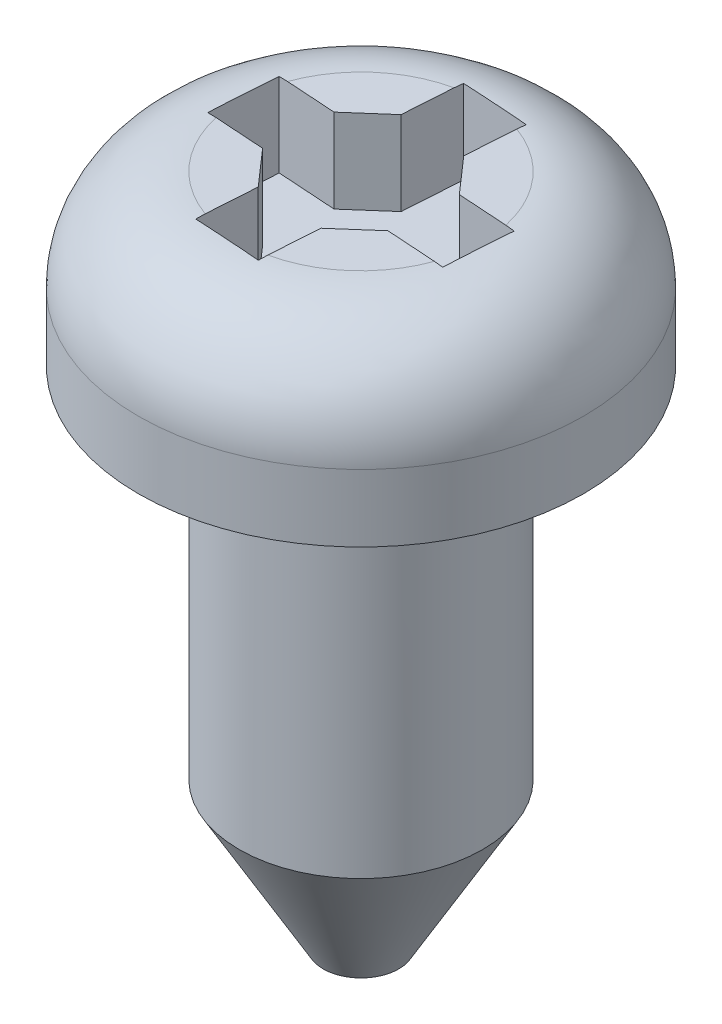
ISO-10303-21;
HEADER;
FILE_DESCRIPTION(('STEP AP214'),'2;1');
FILE_NAME('part.step','',(''),(''),'','','');
FILE_SCHEMA(('AUTOMOTIVE_DESIGN { 1 0 10303 214 1 1 1 1 }'));
ENDSEC;
DATA;
#1=APPLICATION_CONTEXT('core data for automotive mechanical design processes');
#2=APPLICATION_PROTOCOL_DEFINITION('international standard','automotive_design',2000,#1);
#3=PRODUCT_CONTEXT('',#1,'mechanical');
#4=PRODUCT('Part','Part','',(#3));
#5=PRODUCT_RELATED_PRODUCT_CATEGORY('part','',(#4));
#6=PRODUCT_DEFINITION_FORMATION('','',#4);
#7=PRODUCT_DEFINITION_CONTEXT('part definition',#1,'design');
#8=PRODUCT_DEFINITION('design','',#6,#7);
#9=PRODUCT_DEFINITION_SHAPE('','',#8);
#10=(LENGTH_UNIT() NAMED_UNIT(*) SI_UNIT(.MILLI.,.METRE.));
#11=(NAMED_UNIT(*) PLANE_ANGLE_UNIT() SI_UNIT($,.RADIAN.));
#12=(NAMED_UNIT(*) SI_UNIT($,.STERADIAN.) SOLID_ANGLE_UNIT());
#13=UNCERTAINTY_MEASURE_WITH_UNIT(LENGTH_MEASURE(1.E-05),#10,'distance_accuracy_value','');
#14=(GEOMETRIC_REPRESENTATION_CONTEXT(3) GLOBAL_UNCERTAINTY_ASSIGNED_CONTEXT((#13)) GLOBAL_UNIT_ASSIGNED_CONTEXT((#10,
#11,#12)) REPRESENTATION_CONTEXT('',''));
#15=CARTESIAN_POINT('',(0.,0.,0.));
#16=DIRECTION('',(0.,0.,1.));
#17=DIRECTION('',(1.,0.,0.));
#18=AXIS2_PLACEMENT_3D('',#15,#16,#17);
#19=CARTESIAN_POINT('',(-26.0259458430014,9.29457308248913,-134.653126441172));
#20=DIRECTION('',(-0.751797824615177,0.,0.659393684306946));
#21=DIRECTION('',(0.659393684306946,0.,0.751797824615177));
#22=AXIS2_PLACEMENT_3D('',#19,#20,#21);
#23=PLANE('',#22);
#24=DIRECTION('',(0.,1.,0.));
#25=VECTOR('',#24,1.);
#26=CARTESIAN_POINT('',(-25.6529364464854,9.29457308248913,-134.227845369279));
#27=LINE('',#26,#25);
#28=CARTESIAN_POINT('',(-25.6529364464853,10.2945730824891,-134.227845369279));
#29=VERTEX_POINT('',#28);
#30=CARTESIAN_POINT('',(-25.6529364464854,9.29457308248913,-134.227845369279));
#31=VERTEX_POINT('',#30);
#32=EDGE_CURVE('E557',#29,#31,#27,.F.);
#33=ORIENTED_EDGE('',*,*,#32,.T.);
#34=DIRECTION('',(-0.659393684307242,0.,-0.751797824614917));
#35=VECTOR('',#34,1.);
#36=CARTESIAN_POINT('',(-25.6529364464854,9.29457308248913,-134.227845369279));
#37=LINE('',#36,#35);
#38=CARTESIAN_POINT('',(-26.0259458430014,9.29457308248913,-134.653126441173));
#39=VERTEX_POINT('',#38);
#40=EDGE_CURVE('E555',#31,#39,#37,.T.);
#41=ORIENTED_EDGE('',*,*,#40,.T.);
#42=DIRECTION('',(0.,1.,0.));
#43=VECTOR('',#42,1.);
#44=CARTESIAN_POINT('',(-26.0259458430013,9.29457308248913,-134.653126441173));
#45=LINE('',#44,#43);
#46=CARTESIAN_POINT('',(-26.0259458430015,10.2945730824891,-134.653126441173));
#47=VERTEX_POINT('',#46);
#48=EDGE_CURVE('E540',#39,#47,#45,.T.);
#49=ORIENTED_EDGE('',*,*,#48,.T.);
#50=DIRECTION('',(-0.65939368430744,0.,-0.751797824614743));
#51=VECTOR('',#50,1.);
#52=CARTESIAN_POINT('',(-25.6529364464852,10.2945730824891,-134.227845369279));
#53=LINE('',#52,#51);
#54=EDGE_CURVE('E547',#29,#47,#53,.T.);
#55=ORIENTED_EDGE('',*,*,#54,.F.);
#56=EDGE_LOOP('',(#33,#41,#49,#55));
#57=FACE_BOUND('',#56,.T.);
#58=ADVANCED_FACE('F17',(#57),#23,.F.);
#59=CARTESIAN_POINT('',(-25.9736741676241,9.29457308248913,-135.451416909582));
#60=DIRECTION('',(-0.659393684306945,0.,-0.751797824615177));
#61=DIRECTION('',(-0.751797824615177,0.,0.659393684306945));
#62=AXIS2_PLACEMENT_3D('',#59,#60,#61);
#63=PLANE('',#62);
#64=DIRECTION('',(0.,1.,0.));
#65=VECTOR('',#64,1.);
#66=CARTESIAN_POINT('',(-25.9736741676238,9.29457308248913,-135.451416909582));
#67=LINE('',#66,#65);
#68=CARTESIAN_POINT('',(-25.9736741676238,10.2945730824891,-135.451416909582));
#69=VERTEX_POINT('',#68);
#70=CARTESIAN_POINT('',(-25.9736741676239,9.29457308248913,-135.451416909582));
#71=VERTEX_POINT('',#70);
#72=EDGE_CURVE('E140',#69,#71,#67,.F.);
#73=ORIENTED_EDGE('',*,*,#72,.T.);
#74=DIRECTION('',(0.751797824615237,0.,-0.659393684306877));
#75=VECTOR('',#74,1.);
#76=CARTESIAN_POINT('',(-25.9736741676241,9.29457308248913,-135.451416909582));
#77=LINE('',#76,#75);
#78=CARTESIAN_POINT('',(-25.5483930957307,9.29457308248913,-135.824426306098));
#79=VERTEX_POINT('',#78);
#80=EDGE_CURVE('E133',#71,#79,#77,.T.);
#81=ORIENTED_EDGE('',*,*,#80,.T.);
#82=DIRECTION('',(0.,1.,0.));
#83=VECTOR('',#82,1.);
#84=CARTESIAN_POINT('',(-25.5483930957307,9.29457308248913,-135.824426306098));
#85=LINE('',#84,#83);
#86=CARTESIAN_POINT('',(-25.5483930957307,10.2945730824891,-135.824426306098));
#87=VERTEX_POINT('',#86);
#88=EDGE_CURVE('E476',#79,#87,#85,.T.);
#89=ORIENTED_EDGE('',*,*,#88,.T.);
#90=DIRECTION('',(0.751797824615083,0.,-0.659393684307053));
#91=VECTOR('',#90,1.);
#92=CARTESIAN_POINT('',(-25.9736741676238,10.2945730824891,-135.451416909582));
#93=LINE('',#92,#91);
#94=EDGE_CURVE('E642',#69,#87,#93,.T.);
#95=ORIENTED_EDGE('',*,*,#94,.F.);
#96=EDGE_LOOP('',(#73,#81,#89,#95));
#97=FACE_BOUND('',#96,.T.);
#98=ADVANCED_FACE('F239',(#97),#63,.F.);
#99=CARTESIAN_POINT('',(-24.3770932308055,9.29457308248913,-135.346873558827));
#100=DIRECTION('',(0.751797824615177,0.,-0.659393684306946));
#101=DIRECTION('',(-0.659393684306946,0.,-0.751797824615177));
#102=AXIS2_PLACEMENT_3D('',#99,#100,#101);
#103=PLANE('',#102);
#104=DIRECTION('',(0.,1.,0.));
#105=VECTOR('',#104,1.);
#106=CARTESIAN_POINT('',(-24.7501026273213,9.29457308248913,-135.77215463072));
#107=LINE('',#106,#105);
#108=CARTESIAN_POINT('',(-24.7501026273213,10.2945730824891,-135.77215463072));
#109=VERTEX_POINT('',#108);
#110=CARTESIAN_POINT('',(-24.7501026273213,9.29457308248913,-135.77215463072));
#111=VERTEX_POINT('',#110);
#112=EDGE_CURVE('E628',#109,#111,#107,.F.);
#113=ORIENTED_EDGE('',*,*,#112,.T.);
#114=DIRECTION('',(0.659393684307045,0.,0.75179782461509));
#115=VECTOR('',#114,1.);
#116=CARTESIAN_POINT('',(-24.7501026273213,9.29457308248913,-135.77215463072));
#117=LINE('',#116,#115);
#118=CARTESIAN_POINT('',(-24.3770932308055,9.29457308248913,-135.346873558827));
#119=VERTEX_POINT('',#118);
#120=EDGE_CURVE('E598',#111,#119,#117,.T.);
#121=ORIENTED_EDGE('',*,*,#120,.T.);
#122=DIRECTION('',(0.,1.,0.));
#123=VECTOR('',#122,1.);
#124=CARTESIAN_POINT('',(-24.3770932308055,9.29457308248913,-135.346873558827));
#125=LINE('',#124,#123);
#126=CARTESIAN_POINT('',(-24.3770932308055,10.2945730824891,-135.346873558827));
#127=VERTEX_POINT('',#126);
#128=EDGE_CURVE('E392',#119,#127,#125,.T.);
#129=ORIENTED_EDGE('',*,*,#128,.T.);
#130=DIRECTION('',(0.659393684307343,0.,0.751797824614829));
#131=VECTOR('',#130,1.);
#132=CARTESIAN_POINT('',(-24.7501026273213,10.2945730824891,-135.77215463072));
#133=LINE('',#132,#131);
#134=EDGE_CURVE('E412',#109,#127,#133,.T.);
#135=ORIENTED_EDGE('',*,*,#134,.F.);
#136=EDGE_LOOP('',(#113,#121,#129,#135));
#137=FACE_BOUND('',#136,.T.);
#138=ADVANCED_FACE('F236',(#137),#103,.F.);
#139=CARTESIAN_POINT('',(-24.4293649061824,9.29457308248913,-134.548583090418));
#140=DIRECTION('',(0.659393684306945,0.,0.751797824615177));
#141=DIRECTION('',(0.751797824615177,0.,-0.659393684306945));
#142=AXIS2_PLACEMENT_3D('',#139,#140,#141);
#143=PLANE('',#142);
#144=DIRECTION('',(0.,1.,0.));
#145=VECTOR('',#144,1.);
#146=CARTESIAN_POINT('',(-24.4293649061825,9.29457308248913,-134.548583090417));
#147=LINE('',#146,#145);
#148=CARTESIAN_POINT('',(-24.4293649061824,10.2945730824891,-134.548583090418));
#149=VERTEX_POINT('',#148);
#150=CARTESIAN_POINT('',(-24.4293649061824,9.29457308248913,-134.548583090417));
#151=VERTEX_POINT('',#150);
#152=EDGE_CURVE('E601',#149,#151,#147,.F.);
#153=ORIENTED_EDGE('',*,*,#152,.T.);
#154=DIRECTION('',(-0.751797824615237,0.,0.659393684306877));
#155=VECTOR('',#154,1.);
#156=CARTESIAN_POINT('',(-24.4293649061824,9.29457308248913,-134.548583090418));
#157=LINE('',#156,#155);
#158=CARTESIAN_POINT('',(-24.8546459780758,9.29457308248913,-134.175573693902));
#159=VERTEX_POINT('',#158);
#160=EDGE_CURVE('E558',#151,#159,#157,.T.);
#161=ORIENTED_EDGE('',*,*,#160,.T.);
#162=DIRECTION('',(0.,1.,0.));
#163=VECTOR('',#162,1.);
#164=CARTESIAN_POINT('',(-24.8546459780758,9.29457308248913,-134.175573693902));
#165=LINE('',#164,#163);
#166=CARTESIAN_POINT('',(-24.8546459780758,10.2945730824891,-134.175573693902));
#167=VERTEX_POINT('',#166);
#168=EDGE_CURVE('E593',#159,#167,#165,.T.);
#169=ORIENTED_EDGE('',*,*,#168,.T.);
#170=DIRECTION('',(-0.751797824615237,0.,0.659393684306877));
#171=VECTOR('',#170,1.);
#172=CARTESIAN_POINT('',(-24.4293649061824,10.2945730824891,-134.548583090418));
#173=LINE('',#172,#171);
#174=EDGE_CURVE('E329',#149,#167,#173,.T.);
#175=ORIENTED_EDGE('',*,*,#174,.F.);
#176=EDGE_LOOP('',(#153,#161,#169,#175));
#177=FACE_BOUND('',#176,.T.);
#178=ADVANCED_FACE('F233',(#177),#143,.F.);
#179=CARTESIAN_POINT('',(-25.6268006087967,9.29457308248913,-134.626990603484));
#180=DIRECTION('',(0.,-1.,0.));
#181=DIRECTION('',(1.,0.,0.));
#182=AXIS2_PLACEMENT_3D('',#179,#180,#181);
#183=PLANE('',#182);
#184=ORIENTED_EDGE('',*,*,#40,.F.);
#185=DIRECTION('',(-0.0653395942216626,0.,0.997863085511709));
#186=VECTOR('',#185,1.);
#187=CARTESIAN_POINT('',(-25.6529364464854,9.29457308248913,-134.227845369279));
#188=LINE('',#187,#186);
#189=CARTESIAN_POINT('',(-25.6986741624406,9.29457308248913,-133.529341209421));
#190=VERTEX_POINT('',#189);
#191=EDGE_CURVE('E562',#31,#190,#188,.T.);
#192=ORIENTED_EDGE('',*,*,#191,.T.);
#193=DIRECTION('',(0.997863085511709,0.,0.0653395942216604));
#194=VECTOR('',#193,1.);
#195=CARTESIAN_POINT('',(-25.6986741624402,9.29457308248913,-133.529341209421));
#196=LINE('',#195,#194);
#197=CARTESIAN_POINT('',(-24.9003836940311,9.29457308248913,-133.477069534044));
#198=VERTEX_POINT('',#197);
#199=EDGE_CURVE('E173',#190,#198,#196,.T.);
#200=ORIENTED_EDGE('',*,*,#199,.T.);
#201=DIRECTION('',(0.0653395942216626,0.,-0.997863085511709));
#202=VECTOR('',#201,1.);
#203=CARTESIAN_POINT('',(-24.8546459780758,9.29457308248913,-134.175573693902));
#204=LINE('',#203,#202);
#205=EDGE_CURVE('E216',#198,#159,#204,.T.);
#206=ORIENTED_EDGE('',*,*,#205,.T.);
#207=ORIENTED_EDGE('',*,*,#160,.F.);
#208=DIRECTION('',(0.997863085511709,0.,0.0653395942216663));
#209=VECTOR('',#208,1.);
#210=CARTESIAN_POINT('',(-23.7308607463243,9.29457308248913,-134.502845374462));
#211=LINE('',#210,#209);
#212=CARTESIAN_POINT('',(-23.7308607463244,9.29457308248913,-134.502845374462));
#213=VERTEX_POINT('',#212);
#214=EDGE_CURVE('E603',#151,#213,#211,.T.);
#215=ORIENTED_EDGE('',*,*,#214,.T.);
#216=DIRECTION('',(0.0653395942216658,0.,-0.997863085511709));
#217=VECTOR('',#216,1.);
#218=CARTESIAN_POINT('',(-23.6785890709471,9.29457308248913,-135.301135842872));
#219=LINE('',#218,#217);
#220=CARTESIAN_POINT('',(-23.6785890709471,9.29457308248913,-135.301135842872));
#221=VERTEX_POINT('',#220);
#222=EDGE_CURVE('E391',#213,#221,#219,.T.);
#223=ORIENTED_EDGE('',*,*,#222,.T.);
#224=DIRECTION('',(-0.997863085511709,0.,-0.0653395942216655));
#225=VECTOR('',#224,1.);
#226=CARTESIAN_POINT('',(-23.6785890709471,9.29457308248913,-135.301135842872));
#227=LINE('',#226,#225);
#228=EDGE_CURVE('E613',#221,#119,#227,.T.);
#229=ORIENTED_EDGE('',*,*,#228,.T.);
#230=ORIENTED_EDGE('',*,*,#120,.F.);
#231=DIRECTION('',(0.0653395942216626,0.,-0.997863085511709));
#232=VECTOR('',#231,1.);
#233=CARTESIAN_POINT('',(-24.7501026273213,9.29457308248913,-135.77215463072));
#234=LINE('',#233,#232);
#235=CARTESIAN_POINT('',(-24.7043649113661,9.29457308248913,-136.470658790579));
#236=VERTEX_POINT('',#235);
#237=EDGE_CURVE('E630',#111,#236,#234,.T.);
#238=ORIENTED_EDGE('',*,*,#237,.T.);
#239=DIRECTION('',(-0.997863085511709,0.,-0.0653395942216604));
#240=VECTOR('',#239,1.);
#241=CARTESIAN_POINT('',(-25.5026553797754,9.29457308248913,-136.522930465956));
#242=LINE('',#241,#240);
#243=CARTESIAN_POINT('',(-25.5026553797755,9.29457308248913,-136.522930465956));
#244=VERTEX_POINT('',#243);
#245=EDGE_CURVE('E475',#236,#244,#242,.T.);
#246=ORIENTED_EDGE('',*,*,#245,.T.);
#247=DIRECTION('',(-0.0653395942216626,0.,0.997863085511709));
#248=VECTOR('',#247,1.);
#249=CARTESIAN_POINT('',(-25.5483930957307,9.29457308248913,-135.824426306098));
#250=LINE('',#249,#248);
#251=EDGE_CURVE('E640',#244,#79,#250,.T.);
#252=ORIENTED_EDGE('',*,*,#251,.T.);
#253=ORIENTED_EDGE('',*,*,#80,.F.);
#254=DIRECTION('',(-0.997863085511709,0.,-0.0653395942216663));
#255=VECTOR('',#254,1.);
#256=CARTESIAN_POINT('',(-26.6721783274823,9.29457308248913,-135.497154625537));
#257=LINE('',#256,#255);
#258=CARTESIAN_POINT('',(-26.6721783274823,9.29457308248913,-135.497154625537));
#259=VERTEX_POINT('',#258);
#260=EDGE_CURVE('E516',#71,#259,#257,.T.);
#261=ORIENTED_EDGE('',*,*,#260,.T.);
#262=DIRECTION('',(-0.0653395942216658,0.,0.997863085511709));
#263=VECTOR('',#262,1.);
#264=CARTESIAN_POINT('',(-26.6721783274823,9.29457308248913,-135.497154625537));
#265=LINE('',#264,#263);
#266=CARTESIAN_POINT('',(-26.7244500028596,9.29457308248913,-134.698864157128));
#267=VERTEX_POINT('',#266);
#268=EDGE_CURVE('E520',#259,#267,#265,.T.);
#269=ORIENTED_EDGE('',*,*,#268,.T.);
#270=DIRECTION('',(0.997863085511709,0.,0.0653395942216655));
#271=VECTOR('',#270,1.);
#272=CARTESIAN_POINT('',(-26.7244500028597,9.29457308248913,-134.698864157128));
#273=LINE('',#272,#271);
#274=EDGE_CURVE('E543',#267,#39,#273,.T.);
#275=ORIENTED_EDGE('',*,*,#274,.T.);
#276=EDGE_LOOP('',(#184,#192,#200,#206,#207,#215,#223,#229,#230,#238,#246,#252,#253,#261,#269,#275));
#277=FACE_BOUND('',#276,.T.);
#278=ADVANCED_FACE('F228',(#277),#183,.F.);
#279=CARTESIAN_POINT('',(-25.6529364464854,9.29457308248913,-134.227845369279));
#280=DIRECTION('',(-0.997863085511709,0.,-0.0653395942216626));
#281=DIRECTION('',(-0.0653395942216626,0.,0.997863085511709));
#282=AXIS2_PLACEMENT_3D('',#279,#280,#281);
#283=PLANE('',#282);
#284=DIRECTION('',(0.,1.,0.));
#285=VECTOR('',#284,1.);
#286=CARTESIAN_POINT('',(-25.6986741624406,9.29457308248913,-133.529341209421));
#287=LINE('',#286,#285);
#288=CARTESIAN_POINT('',(-25.6986741624406,10.290194536761,-133.529341209421));
#289=VERTEX_POINT('',#288);
#290=EDGE_CURVE('E190',#289,#190,#287,.F.);
#291=ORIENTED_EDGE('',*,*,#290,.T.);
#292=ORIENTED_EDGE('',*,*,#191,.F.);
#293=ORIENTED_EDGE('',*,*,#32,.F.);
#294=DIRECTION('',(0.0653395942218555,0.,-0.997863085511697));
#295=VECTOR('',#294,1.);
#296=CARTESIAN_POINT('',(-25.6917309149165,10.2945730824891,-133.635378145834));
#297=LINE('',#296,#295);
#298=CARTESIAN_POINT('',(-25.6917309149165,10.2945730824891,-133.635378145834));
#299=VERTEX_POINT('',#298);
#300=EDGE_CURVE('E198',#299,#29,#297,.T.);
#301=ORIENTED_EDGE('',*,*,#300,.F.);
#302=CARTESIAN_POINT('',(-25.6986741624405,10.290194536761,-133.529341209421));
#303=CARTESIAN_POINT('',(-25.6952176092637,10.2945730824891,-133.582129520389));
#304=CARTESIAN_POINT('',(-25.6917309149166,10.2945730824891,-133.635378145834));
#305=B_SPLINE_CURVE_WITH_KNOTS('',2,(#302,#303,#304),.UNSPECIFIED.,.F.,.F.,(3,3),(0.,1.),.UNSPECIFIED.);
#306=EDGE_CURVE('E183',#289,#299,#305,.T.);
#307=ORIENTED_EDGE('',*,*,#306,.F.);
#308=EDGE_LOOP('',(#291,#292,#293,#301,#307));
#309=FACE_BOUND('',#308,.T.);
#310=ADVANCED_FACE('F196',(#309),#283,.F.);
#311=CARTESIAN_POINT('',(-25.2015195369033,10.2945730824891,-135.));
#312=DIRECTION('',(0.,1.,0.));
#313=DIRECTION('',(0.,0.,1.));
#314=AXIS2_PLACEMENT_3D('',#311,#312,#313);
#315=PLANE('',#314);
#316=ORIENTED_EDGE('',*,*,#300,.T.);
#317=ORIENTED_EDGE('',*,*,#54,.T.);
#318=DIRECTION('',(0.997863085511709,0.,0.0653395942216655));
#319=VECTOR('',#318,1.);
#320=CARTESIAN_POINT('',(-26.7244500028597,10.2945730824891,-134.698864157128));
#321=LINE('',#320,#319);
#322=CARTESIAN_POINT('',(-26.6184130664464,10.2945730824891,-134.691920909604));
#323=VERTEX_POINT('',#322);
#324=EDGE_CURVE('E80',#47,#323,#321,.F.);
#325=ORIENTED_EDGE('',*,*,#324,.T.);
#326=CARTESIAN_POINT('',(-25.2015195369033,10.2945730824892,-135.));
#327=DIRECTION('',(0.,-1.,0.));
#328=DIRECTION('',(-0.338076812422813,0.,0.941118520114247));
#329=AXIS2_PLACEMENT_3D('',#326,#327,#328);
#330=CIRCLE('',#329,1.45000000000036);
#331=EDGE_CURVE('E199',#299,#323,#330,.T.);
#332=ORIENTED_EDGE('',*,*,#331,.F.);
#333=EDGE_LOOP('',(#316,#317,#325,#332));
#334=FACE_BOUND('',#333,.T.);
#335=ADVANCED_FACE('F227',(#334),#315,.T.);
#336=CARTESIAN_POINT('',(-26.7244500028597,9.29457308248913,-134.698864157128));
#337=DIRECTION('',(-0.0653395942216655,0.,0.997863085511709));
#338=DIRECTION('',(0.997863085511709,0.,0.0653395942216655));
#339=AXIS2_PLACEMENT_3D('',#336,#337,#338);
#340=PLANE('',#339);
#341=ORIENTED_EDGE('',*,*,#324,.F.);
#342=ORIENTED_EDGE('',*,*,#48,.F.);
#343=ORIENTED_EDGE('',*,*,#274,.F.);
#344=DIRECTION('',(0.,1.,0.));
#345=VECTOR('',#344,1.);
#346=CARTESIAN_POINT('',(-26.7244500028596,9.29457308248913,-134.698864157128));
#347=LINE('',#346,#345);
#348=CARTESIAN_POINT('',(-26.7244500028596,10.2901945367611,-134.698864157128));
#349=VERTEX_POINT('',#348);
#350=EDGE_CURVE('E71',#267,#349,#347,.T.);
#351=ORIENTED_EDGE('',*,*,#350,.T.);
#352=CARTESIAN_POINT('',(-26.6184130664463,10.2945730824891,-134.691920909604));
#353=CARTESIAN_POINT('',(-26.6716616918881,10.2945730824891,-134.695407603951));
#354=CARTESIAN_POINT('',(-26.7244500028597,10.2901945367611,-134.698864157128));
#355=B_SPLINE_CURVE_WITH_KNOTS('',2,(#352,#353,#354),.UNSPECIFIED.,.F.,.F.,(3,3),(0.,1.),.UNSPECIFIED.);
#356=EDGE_CURVE('E201',#323,#349,#355,.T.);
#357=ORIENTED_EDGE('',*,*,#356,.F.);
#358=EDGE_LOOP('',(#341,#342,#343,#351,#357));
#359=FACE_BOUND('',#358,.T.);
#360=ADVANCED_FACE('F526',(#359),#340,.F.);
#361=CARTESIAN_POINT('',(-26.6721783274823,9.29457308248913,-135.497154625537));
#362=DIRECTION('',(-0.997863085511709,0.,-0.0653395942216658));
#363=DIRECTION('',(-0.0653395942216658,0.,0.997863085511709));
#364=AXIS2_PLACEMENT_3D('',#361,#362,#363);
#365=PLANE('',#364);
#366=ORIENTED_EDGE('',*,*,#350,.F.);
#367=ORIENTED_EDGE('',*,*,#268,.F.);
#368=DIRECTION('',(0.,1.,0.));
#369=VECTOR('',#368,1.);
#370=CARTESIAN_POINT('',(-26.6721783274823,9.29457308248913,-135.497154625537));
#371=LINE('',#370,#369);
#372=CARTESIAN_POINT('',(-26.6721783274824,10.290194536761,-135.497154625537));
#373=VERTEX_POINT('',#372);
#374=EDGE_CURVE('E509',#259,#373,#371,.T.);
#375=ORIENTED_EDGE('',*,*,#374,.T.);
#376=CARTESIAN_POINT('',(-26.7244500028596,10.2901945367611,-134.698864157128));
#377=CARTESIAN_POINT('',(-26.7222722814857,10.2909269774353,-134.732122211381));
#378=CARTESIAN_POINT('',(-26.720094368136,10.2914873019811,-134.76538319748));
#379=CARTESIAN_POINT('',(-26.7157383783138,10.2923586930538,-134.831907660881));
#380=CARTESIAN_POINT('',(-26.7135603018472,10.2926697661586,-134.865171138095));
#381=CARTESIAN_POINT('',(-26.7070262625586,10.2933715731058,-134.964958666361));
#382=CARTESIAN_POINT('',(-26.7026702138648,10.2935309633173,-135.031484028847));
#383=CARTESIAN_POINT('',(-26.6939581164771,10.2935309633173,-135.164534753818));
#384=CARTESIAN_POINT('',(-26.6896020677833,10.2933715731058,-135.231060116304));
#385=CARTESIAN_POINT('',(-26.6830680284947,10.2926697661586,-135.33084764457));
#386=CARTESIAN_POINT('',(-26.6808899520281,10.2923586930538,-135.364111121784));
#387=CARTESIAN_POINT('',(-26.6765339622059,10.2914873019811,-135.430635585185));
#388=CARTESIAN_POINT('',(-26.6743560488562,10.2909269774353,-135.463896571284));
#389=CARTESIAN_POINT('',(-26.6721783274823,10.2901945367611,-135.497154625537));
#390=B_SPLINE_CURVE_WITH_KNOTS('',3,(#376,#377,#378,#379,#380,#381,#382,#383,#384,#385,#386,
#387,#388,#389),.UNSPECIFIED.,.F.,.F.,(4,2,2,2,2,2,4),(0.,0.100010330135578,0.200018020854253,
0.400020729846163,0.600023438838073,0.700031129556748,0.800041459692327),.UNSPECIFIED.);
#391=EDGE_CURVE('E675',#349,#373,#390,.T.);
#392=ORIENTED_EDGE('',*,*,#391,.F.);
#393=EDGE_LOOP('',(#366,#367,#375,#392));
#394=FACE_BOUND('',#393,.T.);
#395=ADVANCED_FACE('F503',(#394),#365,.F.);
#396=CARTESIAN_POINT('',(-26.6721783274823,9.29457308248913,-135.497154625537));
#397=DIRECTION('',(0.0653395942216663,0.,-0.997863085511709));
#398=DIRECTION('',(-0.997863085511709,0.,-0.0653395942216663));
#399=AXIS2_PLACEMENT_3D('',#396,#397,#398);
#400=PLANE('',#399);
#401=ORIENTED_EDGE('',*,*,#374,.F.);
#402=ORIENTED_EDGE('',*,*,#260,.F.);
#403=ORIENTED_EDGE('',*,*,#72,.F.);
#404=DIRECTION('',(0.997863085511732,0.,0.0653395942213072));
#405=VECTOR('',#404,1.);
#406=CARTESIAN_POINT('',(-26.5661413910687,10.2945730824891,-135.490211378013));
#407=LINE('',#406,#405);
#408=CARTESIAN_POINT('',(-26.5661413910687,10.2945730824891,-135.490211378013));
#409=VERTEX_POINT('',#408);
#410=EDGE_CURVE('E488',#409,#69,#407,.T.);
#411=ORIENTED_EDGE('',*,*,#410,.F.);
#412=CARTESIAN_POINT('',(-26.6721783274824,10.290194536761,-135.497154625537));
#413=CARTESIAN_POINT('',(-26.6193900165102,10.2945730824891,-135.49369807236));
#414=CARTESIAN_POINT('',(-26.5661413910687,10.2945730824891,-135.490211378013));
#415=B_SPLINE_CURVE_WITH_KNOTS('',2,(#412,#413,#414),.UNSPECIFIED.,.F.,.F.,(3,3),(0.,1.),.UNSPECIFIED.);
#416=EDGE_CURVE('E460',#373,#409,#415,.T.);
#417=ORIENTED_EDGE('',*,*,#416,.F.);
#418=EDGE_LOOP('',(#401,#402,#403,#411,#417));
#419=FACE_BOUND('',#418,.T.);
#420=ADVANCED_FACE('F499',(#419),#400,.F.);
#421=CARTESIAN_POINT('',(-25.2015195369033,10.2945730824891,-135.));
#422=DIRECTION('',(0.,1.,0.));
#423=DIRECTION('',(0.,0.,1.));
#424=AXIS2_PLACEMENT_3D('',#421,#422,#423);
#425=PLANE('',#424);
#426=DIRECTION('',(-0.0653395942216626,0.,0.997863085511709));
#427=VECTOR('',#426,1.);
#428=CARTESIAN_POINT('',(-25.5483930957307,10.2945730824891,-135.824426306098));
#429=LINE('',#428,#427);
#430=CARTESIAN_POINT('',(-25.5095986272994,10.2945730824891,-136.416893529543));
#431=VERTEX_POINT('',#430);
#432=EDGE_CURVE('E468',#87,#431,#429,.F.);
#433=ORIENTED_EDGE('',*,*,#432,.T.);
#434=CARTESIAN_POINT('',(-25.2015195369033,10.2945730824892,-135.));
#435=DIRECTION('',(0.,-1.,0.));
#436=DIRECTION('',(-0.941118520114251,0.,-0.338076812422803));
#437=AXIS2_PLACEMENT_3D('',#434,#435,#436);
#438=CIRCLE('',#437,1.44999999999973);
#439=EDGE_CURVE('E459',#409,#431,#438,.T.);
#440=ORIENTED_EDGE('',*,*,#439,.F.);
#441=ORIENTED_EDGE('',*,*,#410,.T.);
#442=ORIENTED_EDGE('',*,*,#94,.T.);
#443=EDGE_LOOP('',(#433,#440,#441,#442));
#444=FACE_BOUND('',#443,.T.);
#445=ADVANCED_FACE('F490',(#444),#425,.T.);
#446=CARTESIAN_POINT('',(-25.5483930957307,9.29457308248913,-135.824426306098));
#447=DIRECTION('',(-0.997863085511709,0.,-0.0653395942216626));
#448=DIRECTION('',(-0.0653395942216626,0.,0.997863085511709));
#449=AXIS2_PLACEMENT_3D('',#446,#447,#448);
#450=PLANE('',#449);
#451=ORIENTED_EDGE('',*,*,#432,.F.);
#452=ORIENTED_EDGE('',*,*,#88,.F.);
#453=ORIENTED_EDGE('',*,*,#251,.F.);
#454=DIRECTION('',(0.,1.,0.));
#455=VECTOR('',#454,1.);
#456=CARTESIAN_POINT('',(-25.5026553797754,9.29457308248913,-136.522930465956));
#457=LINE('',#456,#455);
#458=CARTESIAN_POINT('',(-25.5026553797754,10.2901945367611,-136.522930465956));
#459=VERTEX_POINT('',#458);
#460=EDGE_CURVE('E631',#244,#459,#457,.T.);
#461=ORIENTED_EDGE('',*,*,#460,.T.);
#462=CARTESIAN_POINT('',(-25.5095986272995,10.2945730824891,-136.416893529543));
#463=CARTESIAN_POINT('',(-25.5061119329527,10.2945730824891,-136.470142154984));
#464=CARTESIAN_POINT('',(-25.5026553797756,10.2901945367611,-136.522930465956));
#465=B_SPLINE_CURVE_WITH_KNOTS('',2,(#462,#463,#464),.UNSPECIFIED.,.F.,.F.,(3,3),(0.,1.),.UNSPECIFIED.);
#466=EDGE_CURVE('E455',#431,#459,#465,.T.);
#467=ORIENTED_EDGE('',*,*,#466,.F.);
#468=EDGE_LOOP('',(#451,#452,#453,#461,#467));
#469=FACE_BOUND('',#468,.T.);
#470=ADVANCED_FACE('F443',(#469),#450,.F.);
#471=CARTESIAN_POINT('',(-25.5026553797754,9.29457308248913,-136.522930465956));
#472=DIRECTION('',(0.0653395942216604,0.,-0.997863085511709));
#473=DIRECTION('',(-0.997863085511709,0.,-0.0653395942216604));
#474=AXIS2_PLACEMENT_3D('',#471,#472,#473);
#475=PLANE('',#474);
#476=CARTESIAN_POINT('',(-25.5026553797754,10.2901945367611,-136.522930465956));
#477=CARTESIAN_POINT('',(-25.4693973255221,10.2909269774353,-136.520752744582));
#478=CARTESIAN_POINT('',(-25.4361363394233,10.2914873019811,-136.518574831232));
#479=CARTESIAN_POINT('',(-25.3696118760223,10.2923586930539,-136.51421884141));
#480=CARTESIAN_POINT('',(-25.3363483988088,10.2926697661586,-136.512040764944));
#481=CARTESIAN_POINT('',(-25.236560870542,10.2933715731058,-136.505506725655));
#482=CARTESIAN_POINT('',(-25.1700355080564,10.2935309633173,-136.501150676961));
#483=CARTESIAN_POINT('',(-25.0369847830852,10.2935309633173,-136.492438579574));
#484=CARTESIAN_POINT('',(-24.9704594205996,10.2933715731058,-136.48808253088));
#485=CARTESIAN_POINT('',(-24.8706718923327,10.2926697661586,-136.481548491591));
#486=CARTESIAN_POINT('',(-24.8374084151193,10.2923586930539,-136.479370415124));
#487=CARTESIAN_POINT('',(-24.7708839517182,10.2914873019812,-136.475014425302));
#488=CARTESIAN_POINT('',(-24.7376229656195,10.2909269774353,-136.472836511953));
#489=CARTESIAN_POINT('',(-24.7043649113661,10.2901945367611,-136.470658790579));
#490=B_SPLINE_CURVE_WITH_KNOTS('',3,(#476,#477,#478,#479,#480,#481,#482,#483,#484,#485,#486,
#487,#488,#489),.UNSPECIFIED.,.F.,.F.,(4,2,2,2,2,2,4),(0.,0.100010330135606,0.20001802085432,
0.400020729846274,0.600023438838275,0.700031129557009,0.800041459692641),.UNSPECIFIED.);
#491=CARTESIAN_POINT('',(-24.7043649113661,10.290194536761,-136.470658790579));
#492=VERTEX_POINT('',#491);
#493=EDGE_CURVE('E448',#459,#492,#490,.T.);
#494=ORIENTED_EDGE('',*,*,#493,.F.);
#495=ORIENTED_EDGE('',*,*,#460,.F.);
#496=ORIENTED_EDGE('',*,*,#245,.F.);
#497=DIRECTION('',(0.,1.,0.));
#498=VECTOR('',#497,1.);
#499=CARTESIAN_POINT('',(-24.7043649113661,9.29457308248913,-136.470658790579));
#500=LINE('',#499,#498);
#501=EDGE_CURVE('E413',#236,#492,#500,.T.);
#502=ORIENTED_EDGE('',*,*,#501,.T.);
#503=EDGE_LOOP('',(#494,#495,#496,#502));
#504=FACE_BOUND('',#503,.T.);
#505=ADVANCED_FACE('F438',(#504),#475,.F.);
#506=CARTESIAN_POINT('',(-24.7501026273213,9.29457308248913,-135.77215463072));
#507=DIRECTION('',(0.997863085511709,0.,0.0653395942216626));
#508=DIRECTION('',(0.0653395942216626,0.,-0.997863085511709));
#509=AXIS2_PLACEMENT_3D('',#506,#507,#508);
#510=PLANE('',#509);
#511=ORIENTED_EDGE('',*,*,#501,.F.);
#512=ORIENTED_EDGE('',*,*,#237,.F.);
#513=ORIENTED_EDGE('',*,*,#112,.F.);
#514=DIRECTION('',(-0.065339594221518,0.,0.997863085511719));
#515=VECTOR('',#514,1.);
#516=CARTESIAN_POINT('',(-24.7113081588902,10.2945730824891,-136.364621854165));
#517=LINE('',#516,#515);
#518=CARTESIAN_POINT('',(-24.7113081588902,10.2945730824891,-136.364621854165));
#519=VERTEX_POINT('',#518);
#520=EDGE_CURVE('E405',#519,#109,#517,.T.);
#521=ORIENTED_EDGE('',*,*,#520,.F.);
#522=CARTESIAN_POINT('',(-24.7043649113661,10.290194536761,-136.470658790579));
#523=CARTESIAN_POINT('',(-24.707821464543,10.2945730824891,-136.417870479611));
#524=CARTESIAN_POINT('',(-24.7113081588901,10.2945730824891,-136.364621854165));
#525=B_SPLINE_CURVE_WITH_KNOTS('',2,(#522,#523,#524),.UNSPECIFIED.,.F.,.F.,(3,3),(0.,1.),.UNSPECIFIED.);
#526=EDGE_CURVE('E454',#492,#519,#525,.T.);
#527=ORIENTED_EDGE('',*,*,#526,.F.);
#528=EDGE_LOOP('',(#511,#512,#513,#521,#527));
#529=FACE_BOUND('',#528,.T.);
#530=ADVANCED_FACE('F429',(#529),#510,.F.);
#531=CARTESIAN_POINT('',(-25.2015195369033,10.2945730824891,-135.));
#532=DIRECTION('',(0.,1.,0.));
#533=DIRECTION('',(0.,0.,1.));
#534=AXIS2_PLACEMENT_3D('',#531,#532,#533);
#535=PLANE('',#534);
#536=DIRECTION('',(-0.997863085511709,0.,-0.0653395942216655));
#537=VECTOR('',#536,1.);
#538=CARTESIAN_POINT('',(-23.6785890709471,10.2945730824891,-135.301135842872));
#539=LINE('',#538,#537);
#540=CARTESIAN_POINT('',(-23.7846260073606,10.2945730824891,-135.308079090396));
#541=VERTEX_POINT('',#540);
#542=EDGE_CURVE('E384',#127,#541,#539,.F.);
#543=ORIENTED_EDGE('',*,*,#542,.T.);
#544=CARTESIAN_POINT('',(-25.2015195369033,10.2945730824892,-135.));
#545=DIRECTION('',(0.,-1.,0.));
#546=DIRECTION('',(0.338076812422971,0.,-0.94111852011419));
#547=AXIS2_PLACEMENT_3D('',#544,#545,#546);
#548=CIRCLE('',#547,1.44999999999939);
#549=EDGE_CURVE('E400',#519,#541,#548,.T.);
#550=ORIENTED_EDGE('',*,*,#549,.F.);
#551=ORIENTED_EDGE('',*,*,#520,.T.);
#552=ORIENTED_EDGE('',*,*,#134,.T.);
#553=EDGE_LOOP('',(#543,#550,#551,#552));
#554=FACE_BOUND('',#553,.T.);
#555=ADVANCED_FACE('F374',(#554),#535,.T.);
#556=CARTESIAN_POINT('',(-23.6785890709471,9.29457308248913,-135.301135842872));
#557=DIRECTION('',(0.0653395942216655,0.,-0.997863085511709));
#558=DIRECTION('',(-0.997863085511709,0.,-0.0653395942216655));
#559=AXIS2_PLACEMENT_3D('',#556,#557,#558);
#560=PLANE('',#559);
#561=ORIENTED_EDGE('',*,*,#542,.F.);
#562=ORIENTED_EDGE('',*,*,#128,.F.);
#563=ORIENTED_EDGE('',*,*,#228,.F.);
#564=DIRECTION('',(0.,1.,0.));
#565=VECTOR('',#564,1.);
#566=CARTESIAN_POINT('',(-23.6785890709471,9.29457308248913,-135.301135842872));
#567=LINE('',#566,#565);
#568=CARTESIAN_POINT('',(-23.6785890709471,10.2901945367611,-135.301135842872));
#569=VERTEX_POINT('',#568);
#570=EDGE_CURVE('E604',#221,#569,#567,.T.);
#571=ORIENTED_EDGE('',*,*,#570,.T.);
#572=CARTESIAN_POINT('',(-23.7846260073605,10.2945730824891,-135.308079090396));
#573=CARTESIAN_POINT('',(-23.7313773819189,10.2945730824891,-135.304592396049));
#574=CARTESIAN_POINT('',(-23.678589070947,10.2901945367611,-135.301135842872));
#575=B_SPLINE_CURVE_WITH_KNOTS('',2,(#572,#573,#574),.UNSPECIFIED.,.F.,.F.,(3,3),(0.,1.),.UNSPECIFIED.);
#576=EDGE_CURVE('E362',#541,#569,#575,.T.);
#577=ORIENTED_EDGE('',*,*,#576,.F.);
#578=EDGE_LOOP('',(#561,#562,#563,#571,#577));
#579=FACE_BOUND('',#578,.T.);
#580=ADVANCED_FACE('F369',(#579),#560,.F.);
#581=CARTESIAN_POINT('',(-23.6785890709471,9.29457308248913,-135.301135842872));
#582=DIRECTION('',(0.997863085511709,0.,0.0653395942216658));
#583=DIRECTION('',(0.0653395942216658,0.,-0.997863085511709));
#584=AXIS2_PLACEMENT_3D('',#581,#582,#583);
#585=PLANE('',#584);
#586=ORIENTED_EDGE('',*,*,#570,.F.);
#587=ORIENTED_EDGE('',*,*,#222,.F.);
#588=DIRECTION('',(0.,1.,0.));
#589=VECTOR('',#588,1.);
#590=CARTESIAN_POINT('',(-23.7308607463243,9.29457308248913,-134.502845374462));
#591=LINE('',#590,#589);
#592=CARTESIAN_POINT('',(-23.7308607463243,10.290194536761,-134.502845374462));
#593=VERTEX_POINT('',#592);
#594=EDGE_CURVE('E330',#213,#593,#591,.T.);
#595=ORIENTED_EDGE('',*,*,#594,.T.);
#596=CARTESIAN_POINT('',(-23.6785890709471,10.2901945367611,-135.301135842872));
#597=CARTESIAN_POINT('',(-23.680766792321,10.2909269774353,-135.267877788619));
#598=CARTESIAN_POINT('',(-23.6829447056707,10.2914873019811,-135.23461680252));
#599=CARTESIAN_POINT('',(-23.6873006954929,10.2923586930539,-135.168092339119));
#600=CARTESIAN_POINT('',(-23.6894787719596,10.2926697661586,-135.134828861905));
#601=CARTESIAN_POINT('',(-23.6960128112481,10.2933715731058,-135.035041333638));
#602=CARTESIAN_POINT('',(-23.700368859942,10.2935309633173,-134.968515971153));
#603=CARTESIAN_POINT('',(-23.7090809573296,10.2935309633173,-134.835465246181));
#604=CARTESIAN_POINT('',(-23.7134370060234,10.2933715731058,-134.768939883696));
#605=CARTESIAN_POINT('',(-23.719971045312,10.2926697661586,-134.669152355429));
#606=CARTESIAN_POINT('',(-23.7221491217787,10.2923586930538,-134.635888878215));
#607=CARTESIAN_POINT('',(-23.7265051116009,10.2914873019811,-134.569364414814));
#608=CARTESIAN_POINT('',(-23.7286830249506,10.2909269774353,-134.536103428715));
#609=CARTESIAN_POINT('',(-23.7308607463245,10.2901945367611,-134.502845374462));
#610=B_SPLINE_CURVE_WITH_KNOTS('',3,(#596,#597,#598,#599,#600,#601,#602,#603,#604,#605,#606,
#607,#608,#609),.UNSPECIFIED.,.F.,.F.,(4,2,2,2,2,2,4),(0.,0.100010330135717,0.200018020854503,
0.400020729846636,0.600023438838796,0.700031129557583,0.8000414596933),.UNSPECIFIED.);
#611=EDGE_CURVE('E356',#569,#593,#610,.T.);
#612=ORIENTED_EDGE('',*,*,#611,.F.);
#613=EDGE_LOOP('',(#586,#587,#595,#612));
#614=FACE_BOUND('',#613,.T.);
#615=ADVANCED_FACE('F365',(#614),#585,.F.);
#616=CARTESIAN_POINT('',(-23.7308607463243,9.29457308248913,-134.502845374462));
#617=DIRECTION('',(-0.0653395942216663,0.,0.997863085511709));
#618=DIRECTION('',(0.997863085511709,0.,0.0653395942216663));
#619=AXIS2_PLACEMENT_3D('',#616,#617,#618);
#620=PLANE('',#619);
#621=ORIENTED_EDGE('',*,*,#594,.F.);
#622=ORIENTED_EDGE('',*,*,#214,.F.);
#623=ORIENTED_EDGE('',*,*,#152,.F.);
#624=DIRECTION('',(-0.997863085511617,0.,-0.0653395942230764));
#625=VECTOR('',#624,1.);
#626=CARTESIAN_POINT('',(-23.8368976827375,10.2945730824891,-134.509788621986));
#627=LINE('',#626,#625);
#628=CARTESIAN_POINT('',(-23.8368976827375,10.2945730824891,-134.509788621986));
#629=VERTEX_POINT('',#628);
#630=EDGE_CURVE('E321',#629,#149,#627,.T.);
#631=ORIENTED_EDGE('',*,*,#630,.F.);
#632=CARTESIAN_POINT('',(-23.7308607463243,10.290194536761,-134.502845374462));
#633=CARTESIAN_POINT('',(-23.7836490572962,10.2945730824891,-134.506301927639));
#634=CARTESIAN_POINT('',(-23.8368976827375,10.2945730824891,-134.509788621986));
#635=B_SPLINE_CURVE_WITH_KNOTS('',2,(#632,#633,#634),.UNSPECIFIED.,.F.,.F.,(3,3),(0.,1.),.UNSPECIFIED.);
#636=EDGE_CURVE('E354',#593,#629,#635,.T.);
#637=ORIENTED_EDGE('',*,*,#636,.F.);
#638=EDGE_LOOP('',(#621,#622,#623,#631,#637));
#639=FACE_BOUND('',#638,.T.);
#640=ADVANCED_FACE('F311',(#639),#620,.F.);
#641=CARTESIAN_POINT('',(-25.2015195369033,10.2945730824891,-135.));
#642=DIRECTION('',(0.,1.,0.));
#643=DIRECTION('',(0.,0.,1.));
#644=AXIS2_PLACEMENT_3D('',#641,#642,#643);
#645=PLANE('',#644);
#646=DIRECTION('',(0.0653395942216626,0.,-0.997863085511709));
#647=VECTOR('',#646,1.);
#648=CARTESIAN_POINT('',(-24.8546459780758,10.2945730824891,-134.175573693902));
#649=LINE('',#648,#647);
#650=CARTESIAN_POINT('',(-24.893440446507,10.2945730824891,-133.583106470457));
#651=VERTEX_POINT('',#650);
#652=EDGE_CURVE('E194',#167,#651,#649,.F.);
#653=ORIENTED_EDGE('',*,*,#652,.T.);
#654=CARTESIAN_POINT('',(-25.2015195369033,10.2945730824892,-135.));
#655=DIRECTION('',(0.,-1.,0.));
#656=DIRECTION('',(0.94111852011405,0.,0.338076812423362));
#657=AXIS2_PLACEMENT_3D('',#654,#655,#656);
#658=CIRCLE('',#657,1.45000000000045);
#659=EDGE_CURVE('E335',#629,#651,#658,.T.);
#660=ORIENTED_EDGE('',*,*,#659,.F.);
#661=ORIENTED_EDGE('',*,*,#630,.T.);
#662=ORIENTED_EDGE('',*,*,#174,.T.);
#663=EDGE_LOOP('',(#653,#660,#661,#662));
#664=FACE_BOUND('',#663,.T.);
#665=ADVANCED_FACE('F306',(#664),#645,.T.);
#666=CARTESIAN_POINT('',(-24.8546459780758,9.29457308248913,-134.175573693902));
#667=DIRECTION('',(0.997863085511709,0.,0.0653395942216626));
#668=DIRECTION('',(0.0653395942216626,0.,-0.997863085511709));
#669=AXIS2_PLACEMENT_3D('',#666,#667,#668);
#670=PLANE('',#669);
#671=ORIENTED_EDGE('',*,*,#652,.F.);
#672=ORIENTED_EDGE('',*,*,#168,.F.);
#673=ORIENTED_EDGE('',*,*,#205,.F.);
#674=DIRECTION('',(0.,1.,0.));
#675=VECTOR('',#674,1.);
#676=CARTESIAN_POINT('',(-24.9003836940312,9.29457308248913,-133.477069534044));
#677=LINE('',#676,#675);
#678=CARTESIAN_POINT('',(-24.9003836940311,10.2901945367611,-133.477069534044));
#679=VERTEX_POINT('',#678);
#680=EDGE_CURVE('E37',#198,#679,#677,.T.);
#681=ORIENTED_EDGE('',*,*,#680,.T.);
#682=CARTESIAN_POINT('',(-24.893440446507,10.2945730824891,-133.583106470457));
#683=CARTESIAN_POINT('',(-24.8969271408539,10.2945730824891,-133.529857845015));
#684=CARTESIAN_POINT('',(-24.900383694031,10.2901945367611,-133.477069534043));
#685=B_SPLINE_CURVE_WITH_KNOTS('',2,(#682,#683,#684),.UNSPECIFIED.,.F.,.F.,(3,3),(0.,1.),.UNSPECIFIED.);
#686=EDGE_CURVE('E185',#651,#679,#685,.T.);
#687=ORIENTED_EDGE('',*,*,#686,.F.);
#688=EDGE_LOOP('',(#671,#672,#673,#681,#687));
#689=FACE_BOUND('',#688,.T.);
#690=ADVANCED_FACE('F297',(#689),#670,.F.);
#691=CARTESIAN_POINT('',(-25.6986741624402,9.29457308248913,-133.529341209421));
#692=DIRECTION('',(-0.0653395942216604,0.,0.997863085511709));
#693=DIRECTION('',(0.997863085511709,0.,0.0653395942216604));
#694=AXIS2_PLACEMENT_3D('',#691,#692,#693);
#695=PLANE('',#694);
#696=CARTESIAN_POINT('',(-24.9003836940311,10.2901945367611,-133.477069534044));
#697=CARTESIAN_POINT('',(-24.9336417482845,10.2909269774353,-133.479247255418));
#698=CARTESIAN_POINT('',(-24.9669027343832,10.2914873019811,-133.481425168767));
#699=CARTESIAN_POINT('',(-25.0334271977843,10.2923586930538,-133.485781158589));
#700=CARTESIAN_POINT('',(-25.0666906749977,10.2926697661586,-133.487959235056));
#701=CARTESIAN_POINT('',(-25.1664782032646,10.2933715731058,-133.494493274345));
#702=CARTESIAN_POINT('',(-25.2330035657502,10.2935309633173,-133.498849323039));
#703=CARTESIAN_POINT('',(-25.3660542907214,10.2935309633173,-133.507561420426));
#704=CARTESIAN_POINT('',(-25.432579653207,10.2933715731058,-133.51191746912));
#705=CARTESIAN_POINT('',(-25.5323671814739,10.2926697661586,-133.518451508409));
#706=CARTESIAN_POINT('',(-25.5656306586874,10.2923586930538,-133.520629584875));
#707=CARTESIAN_POINT('',(-25.6321551220885,10.2914873019811,-133.524985574697));
#708=CARTESIAN_POINT('',(-25.6654161081872,10.2909269774353,-133.527163488047));
#709=CARTESIAN_POINT('',(-25.6986741624406,10.2901945367611,-133.529341209421));
#710=B_SPLINE_CURVE_WITH_KNOTS('',3,(#696,#697,#698,#699,#700,#701,#702,#703,#704,#705,#706,
#707,#708,#709),.UNSPECIFIED.,.F.,.F.,(4,2,2,2,2,2,4),(0.,0.10001033013562,0.200018020854343,
0.400020729846323,0.600023438838369,0.70003112955713,0.800041459692787),.UNSPECIFIED.);
#711=EDGE_CURVE('E178',#679,#289,#710,.T.);
#712=ORIENTED_EDGE('',*,*,#711,.F.);
#713=ORIENTED_EDGE('',*,*,#680,.F.);
#714=ORIENTED_EDGE('',*,*,#199,.F.);
#715=ORIENTED_EDGE('',*,*,#290,.F.);
#716=EDGE_LOOP('',(#712,#713,#714,#715));
#717=FACE_BOUND('',#716,.T.);
#718=ADVANCED_FACE('F191',(#717),#695,.F.);
#719=CARTESIAN_POINT('',(-25.2015195369033,9.09457308248915,-135.));
#720=DIRECTION('',(0.,1.,0.));
#721=DIRECTION('',(0.065339594221661,0.,-0.997863085511709));
#722=AXIS2_PLACEMENT_3D('',#719,#720,#721);
#723=TOROIDAL_SURFACE('',#722,1.45000000000001,1.2);
#724=CARTESIAN_POINT('',(-25.2015195369033,9.09457308248915,-135.));
#725=DIRECTION('',(0.,1.,0.));
#726=DIRECTION('',(-1.,0.,0.));
#727=AXIS2_PLACEMENT_3D('',#724,#725,#726);
#728=CIRCLE('',#727,2.65);
#729=CARTESIAN_POINT('',(-27.8515195369033,9.09457308248915,-135.));
#730=VERTEX_POINT('',#729);
#731=EDGE_CURVE('E187',#730,#730,#728,.F.);
#732=ORIENTED_EDGE('',*,*,#731,.F.);
#733=EDGE_LOOP('',(#732));
#734=FACE_BOUND('',#733,.T.);
#735=ORIENTED_EDGE('',*,*,#686,.T.);
#736=ORIENTED_EDGE('',*,*,#711,.T.);
#737=ORIENTED_EDGE('',*,*,#306,.T.);
#738=ORIENTED_EDGE('',*,*,#331,.T.);
#739=ORIENTED_EDGE('',*,*,#356,.T.);
#740=ORIENTED_EDGE('',*,*,#391,.T.);
#741=ORIENTED_EDGE('',*,*,#416,.T.);
#742=ORIENTED_EDGE('',*,*,#439,.T.);
#743=ORIENTED_EDGE('',*,*,#466,.T.);
#744=ORIENTED_EDGE('',*,*,#493,.T.);
#745=ORIENTED_EDGE('',*,*,#526,.T.);
#746=ORIENTED_EDGE('',*,*,#549,.T.);
#747=ORIENTED_EDGE('',*,*,#576,.T.);
#748=ORIENTED_EDGE('',*,*,#611,.T.);
#749=ORIENTED_EDGE('',*,*,#636,.T.);
#750=ORIENTED_EDGE('',*,*,#659,.T.);
#751=EDGE_LOOP('',(#735,#736,#737,#738,#739,#740,#741,#742,#743,#744,#745,#746,#747,#748,#749,#750));
#752=FACE_BOUND('',#751,.T.);
#753=ADVANCED_FACE('F180',(#734,#752),#723,.T.);
#754=CARTESIAN_POINT('',(-25.2015195369031,2.29457308248912,-134.999999999999));
#755=DIRECTION('',(0.,1.,0.));
#756=DIRECTION('',(0.,0.,1.));
#757=AXIS2_PLACEMENT_3D('',#754,#755,#756);
#758=PLANE('',#757);
#759=CARTESIAN_POINT('',(-25.2015195369032,2.29457308250858,-135.));
#760=DIRECTION('',(0.,1.,0.));
#761=DIRECTION('',(0.,0.,1.));
#762=AXIS2_PLACEMENT_3D('',#759,#760,#761);
#763=CIRCLE('',#762,0.449999999953789);
#764=CARTESIAN_POINT('',(-25.2015195369032,2.29457308250858,-134.550000000046));
#765=VERTEX_POINT('',#764);
#766=EDGE_CURVE('E568',#765,#765,#763,.T.);
#767=ORIENTED_EDGE('',*,*,#766,.F.);
#768=EDGE_LOOP('',(#767));
#769=FACE_BOUND('',#768,.T.);
#770=ADVANCED_FACE('F267',(#769),#758,.F.);
#771=CARTESIAN_POINT('',(-25.2015195369033,10.2945730824891,-135.));
#772=DIRECTION('',(0.,1.,0.));
#773=DIRECTION('',(-1.,0.,0.));
#774=AXIS2_PLACEMENT_3D('',#771,#772,#773);
#775=CYLINDRICAL_SURFACE('',#774,2.65);
#776=ORIENTED_EDGE('',*,*,#731,.T.);
#777=EDGE_LOOP('',(#776));
#778=FACE_BOUND('',#777,.T.);
#779=CARTESIAN_POINT('',(-25.2015195369033,8.29457308248913,-135.));
#780=DIRECTION('',(0.,1.,0.));
#781=DIRECTION('',(-1.,0.,0.));
#782=AXIS2_PLACEMENT_3D('',#779,#780,#781);
#783=CIRCLE('',#782,2.65);
#784=CARTESIAN_POINT('',(-27.8515195369033,8.29457308248913,-135.));
#785=VERTEX_POINT('',#784);
#786=EDGE_CURVE('E565',#785,#785,#783,.T.);
#787=ORIENTED_EDGE('',*,*,#786,.T.);
#788=EDGE_LOOP('',(#787));
#789=FACE_BOUND('',#788,.T.);
#790=ADVANCED_FACE('F263',(#778,#789),#775,.T.);
#791=CARTESIAN_POINT('',(-25.2015195369032,4.02662389006991,-135.));
#792=DIRECTION('',(0.,1.,0.));
#793=DIRECTION('',(0.,0.,1.));
#794=AXIS2_PLACEMENT_3D('',#791,#792,#793);
#795=CONICAL_SURFACE('',#794,1.44999999996793,0.523598775606306);
#796=CARTESIAN_POINT('',(-25.2015195369031,4.02662389005801,-134.999999999999));
#797=DIRECTION('',(0.,-1.,0.));
#798=DIRECTION('',(1.,0.,0.));
#799=AXIS2_PLACEMENT_3D('',#796,#797,#798);
#800=CIRCLE('',#799,1.45000000000001);
#801=CARTESIAN_POINT('',(-25.2015195369032,4.02662389005801,-133.550000000039));
#802=VERTEX_POINT('',#801);
#803=EDGE_CURVE('E28',#802,#802,#800,.F.);
#804=CARTESIAN_POINT('',(-25.2015195369032,2.29457308250858,-134.550000000046));
#805=CARTESIAN_POINT('',(-25.2015195369032,2.31261527842054,-134.539583333379));
#806=CARTESIAN_POINT('',(-25.2015195369032,2.33065747433252,-134.529166666713));
#807=CARTESIAN_POINT('',(-25.2015195369032,2.36674186615647,-134.508333333379));
#808=CARTESIAN_POINT('',(-25.2015195369032,2.38478406206845,-134.497916666713));
#809=CARTESIAN_POINT('',(-25.2015195369032,2.42086845389239,-134.477083333379));
#810=CARTESIAN_POINT('',(-25.2015195369032,2.43891064980436,-134.466666666712));
#811=CARTESIAN_POINT('',(-25.2015195369032,2.47499504162831,-134.445833333379));
#812=CARTESIAN_POINT('',(-25.2015195369032,2.49303723754028,-134.435416666712));
#813=CARTESIAN_POINT('',(-25.2015195369032,2.52912162936423,-134.414583333379));
#814=CARTESIAN_POINT('',(-25.2015195369032,2.5471638252762,-134.404166666712));
#815=CARTESIAN_POINT('',(-25.2015195369032,2.58324821710015,-134.383333333378));
#816=CARTESIAN_POINT('',(-25.2015195369032,2.60129041301212,-134.372916666712));
#817=CARTESIAN_POINT('',(-25.2015195369032,2.63737480483607,-134.352083333378));
#818=CARTESIAN_POINT('',(-25.2015195369032,2.65541700074804,-134.341666666711));
#819=CARTESIAN_POINT('',(-25.2015195369032,2.69150139257199,-134.320833333378));
#820=CARTESIAN_POINT('',(-25.2015195369032,2.70954358848396,-134.310416666711));
#821=CARTESIAN_POINT('',(-25.2015195369032,2.74562798030791,-134.289583333378));
#822=CARTESIAN_POINT('',(-25.2015195369032,2.76367017621988,-134.279166666711));
#823=CARTESIAN_POINT('',(-25.2015195369032,2.79975456804383,-134.258333333377));
#824=CARTESIAN_POINT('',(-25.2015195369032,2.8177967639558,-134.247916666711));
#825=CARTESIAN_POINT('',(-25.2015195369032,2.85388115577975,-134.227083333377));
#826=CARTESIAN_POINT('',(-25.2015195369032,2.87192335169172,-134.21666666671));
#827=CARTESIAN_POINT('',(-25.2015195369032,2.90800774351567,-134.195833333377));
#828=CARTESIAN_POINT('',(-25.2015195369032,2.92604993942764,-134.18541666671));
#829=CARTESIAN_POINT('',(-25.2015195369032,2.96213433125159,-134.164583333377));
#830=CARTESIAN_POINT('',(-25.2015195369032,2.98017652716356,-134.15416666671));
#831=CARTESIAN_POINT('',(-25.2015195369032,3.01626091898751,-134.133333333377));
#832=CARTESIAN_POINT('',(-25.2015195369032,3.03430311489948,-134.12291666671));
#833=CARTESIAN_POINT('',(-25.2015195369032,3.07038750672343,-134.102083333376));
#834=CARTESIAN_POINT('',(-25.2015195369032,3.0884297026354,-134.09166666671));
#835=CARTESIAN_POINT('',(-25.2015195369032,3.12451409445935,-134.070833333376));
#836=CARTESIAN_POINT('',(-25.2015195369032,3.14255629037132,-134.060416666709));
#837=CARTESIAN_POINT('',(-25.2015195369032,3.17864068219527,-134.039583333376));
#838=CARTESIAN_POINT('',(-25.2015195369032,3.19668287810724,-134.029166666709));
#839=CARTESIAN_POINT('',(-25.2015195369032,3.23276726993119,-134.008333333376));
#840=CARTESIAN_POINT('',(-25.2015195369032,3.25080946584316,-133.997916666709));
#841=CARTESIAN_POINT('',(-25.2015195369032,3.28689385766711,-133.977083333375));
#842=CARTESIAN_POINT('',(-25.2015195369032,3.30493605357908,-133.966666666709));
#843=CARTESIAN_POINT('',(-25.2015195369032,3.34102044540303,-133.945833333375));
#844=CARTESIAN_POINT('',(-25.2015195369032,3.359062641315,-133.935416666708));
#845=CARTESIAN_POINT('',(-25.2015195369032,3.39514703313895,-133.914583333375));
#846=CARTESIAN_POINT('',(-25.2015195369032,3.41318922905092,-133.904166666708));
#847=CARTESIAN_POINT('',(-25.2015195369032,3.44927362087487,-133.883333333375));
#848=CARTESIAN_POINT('',(-25.2015195369032,3.46731581678684,-133.872916666708));
#849=CARTESIAN_POINT('',(-25.2015195369032,3.50340020861078,-133.852083333374));
#850=CARTESIAN_POINT('',(-25.2015195369032,3.52144240452276,-133.841666666708));
#851=CARTESIAN_POINT('',(-25.2015195369032,3.55752679634671,-133.820833333374));
#852=CARTESIAN_POINT('',(-25.2015195369032,3.57556899225868,-133.810416666708));
#853=CARTESIAN_POINT('',(-25.2015195369032,3.61165338408262,-133.789583333374));
#854=CARTESIAN_POINT('',(-25.2015195369032,3.6296955799946,-133.779166666707));
#855=CARTESIAN_POINT('',(-25.2015195369032,3.66577997181855,-133.758333333374));
#856=CARTESIAN_POINT('',(-25.2015195369032,3.68382216773052,-133.747916666707));
#857=CARTESIAN_POINT('',(-25.2015195369032,3.71990655955446,-133.727083333374));
#858=CARTESIAN_POINT('',(-25.2015195369032,3.73794875546644,-133.716666666707));
#859=CARTESIAN_POINT('',(-25.2015195369032,3.77403314729038,-133.695833333373));
#860=CARTESIAN_POINT('',(-25.2015195369032,3.79207534320236,-133.685416666707));
#861=CARTESIAN_POINT('',(-25.2015195369032,3.82815973502631,-133.664583333373));
#862=CARTESIAN_POINT('',(-25.2015195369032,3.84620193093828,-133.654166666706));
#863=CARTESIAN_POINT('',(-25.2015195369032,3.88228632276222,-133.633333333373));
#864=CARTESIAN_POINT('',(-25.2015195369032,3.9003285186742,-133.622916666706));
#865=CARTESIAN_POINT('',(-25.2015195369032,3.93641291049814,-133.602083333373));
#866=CARTESIAN_POINT('',(-25.2015195369032,3.95445510641012,-133.591666666706));
#867=CARTESIAN_POINT('',(-25.2015195369032,3.99053949823406,-133.570833333372));
#868=CARTESIAN_POINT('',(-25.2015195369032,4.00858169414604,-133.560416666706));
#869=CARTESIAN_POINT('',(-25.2015195369032,4.02662389005801,-133.550000000039));
#870=B_SPLINE_CURVE_WITH_KNOTS('',3,(#804,#805,#806,#807,#808,#809,#810,#811,#812,#813,#814,
#815,#816,#817,#818,#819,#820,#821,#822,#823,#824,#825,#826,#827,#828,#829,#830,#831,#832,#833,
#834,#835,#836,#837,#838,#839,#840,#841,#842,#843,#844,#845,#846,#847,#848,#849,#850,#851,#852,
#853,#854,#855,#856,#857,#858,#859,#860,#861,#862,#863,#864,#865,#866,#867,#868,#869),
.UNSPECIFIED.,.F.,.F.,(4,2,2,2,2,2,2,2,2,2,2,2,2,2,2,2,2,2,2,2,2,2,2,2,2,2,2,2,2,2,2,2,4),(0.,
0.0624999999995903,0.124999999999166,0.187499999998756,0.249999999998346,0.312499999997936,
0.374999999997526,0.437499999997102,0.499999999996693,0.562499999996282,0.624999999995872,
0.687499999995462,0.749999999995039,0.812499999994629,0.874999999994219,0.937499999993809,
0.999999999993399,1.06249999999299,1.12499999999256,1.18749999999215,1.24999999999174,
1.31249999999134,1.37499999999093,1.4374999999905,1.49999999999009,1.56249999998968,
1.62499999998927,1.68749999998886,1.74999999998844,1.81249999998803,1.87499999998762,
1.93749999998721,1.9999999999868),.UNSPECIFIED.);
#871=EDGE_CURVE('BSEAM255',#765,#802,#870,.T.);
#872=ORIENTED_EDGE('',*,*,#766,.T.);
#873=ORIENTED_EDGE('',*,*,#803,.F.);
#874=ORIENTED_EDGE('',*,*,#871,.T.);
#875=ORIENTED_EDGE('',*,*,#871,.F.);
#876=EDGE_LOOP('',(#872,#874,#873,#875));
#877=FACE_BOUND('',#876,.T.);
#878=ADVANCED_FACE('F255',(#877),#795,.T.);
#879=CARTESIAN_POINT('',(-25.2015195369032,8.29457308248913,-135.));
#880=DIRECTION('',(0.,1.,0.));
#881=DIRECTION('',(0.,0.,1.));
#882=AXIS2_PLACEMENT_3D('',#879,#880,#881);
#883=PLANE('',#882);
#884=CARTESIAN_POINT('',(-25.2015195369031,8.29457308248913,-134.999999999999));
#885=DIRECTION('',(0.,-1.,0.));
#886=DIRECTION('',(1.,0.,0.));
#887=AXIS2_PLACEMENT_3D('',#884,#885,#886);
#888=CIRCLE('',#887,1.45000000000001);
#889=CARTESIAN_POINT('',(-23.7515195369031,8.29457308248913,-134.999999999999));
#890=VERTEX_POINT('',#889);
#891=EDGE_CURVE('E11',#890,#890,#888,.T.);
#892=ORIENTED_EDGE('',*,*,#891,.F.);
#893=EDGE_LOOP('',(#892));
#894=FACE_BOUND('',#893,.T.);
#895=ORIENTED_EDGE('',*,*,#786,.F.);
#896=EDGE_LOOP('',(#895));
#897=FACE_BOUND('',#896,.T.);
#898=ADVANCED_FACE('F249',(#894,#897),#883,.F.);
#899=CARTESIAN_POINT('',(-25.2015195369031,2.29457308248912,-134.999999999999));
#900=DIRECTION('',(0.,-1.,0.));
#901=DIRECTION('',(1.,0.,0.));
#902=AXIS2_PLACEMENT_3D('',#899,#900,#901);
#903=CYLINDRICAL_SURFACE('',#902,1.45000000000001);
#904=ORIENTED_EDGE('',*,*,#803,.T.);
#905=EDGE_LOOP('',(#904));
#906=FACE_BOUND('',#905,.T.);
#907=ORIENTED_EDGE('',*,*,#891,.T.);
#908=EDGE_LOOP('',(#907));
#909=FACE_BOUND('',#908,.T.);
#910=ADVANCED_FACE('F247',(#906,#909),#903,.T.);
#911=CLOSED_SHELL('',(#58,#98,#138,#178,#278,#310,#335,#360,#395,#420,#445,#470,#505,#530,#555,
#580,#615,#640,#665,#690,#718,#753,#770,#790,#878,#898,#910));
#912=MANIFOLD_SOLID_BREP('B1',#911);
#913=ADVANCED_BREP_SHAPE_REPRESENTATION('',(#18,#912),#14);
#914=SHAPE_DEFINITION_REPRESENTATION(#9,#913);
ENDSEC;
END-ISO-10303-21;
